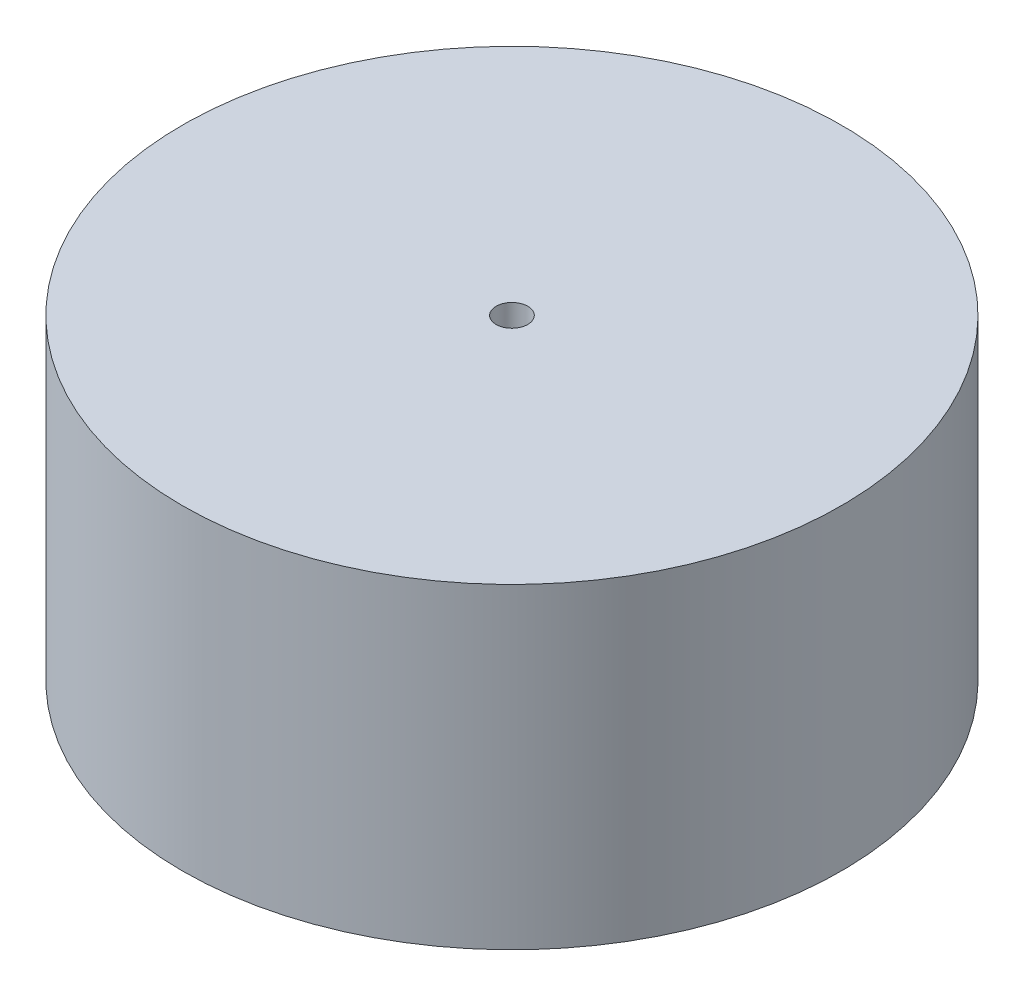
ISO-10303-21;
HEADER;
FILE_DESCRIPTION(('STEP AP214'),'2;1');
FILE_NAME('part.step','',(''),(''),'','','');
FILE_SCHEMA(('AUTOMOTIVE_DESIGN { 1 0 10303 214 1 1 1 1 }'));
ENDSEC;
DATA;
#1=APPLICATION_CONTEXT('core data for automotive mechanical design processes');
#2=APPLICATION_PROTOCOL_DEFINITION('international standard','automotive_design',2000,#1);
#3=PRODUCT_CONTEXT('',#1,'mechanical');
#4=PRODUCT('Part','Part','',(#3));
#5=PRODUCT_RELATED_PRODUCT_CATEGORY('part','',(#4));
#6=PRODUCT_DEFINITION_FORMATION('','',#4);
#7=PRODUCT_DEFINITION_CONTEXT('part definition',#1,'design');
#8=PRODUCT_DEFINITION('design','',#6,#7);
#9=PRODUCT_DEFINITION_SHAPE('','',#8);
#10=(LENGTH_UNIT() NAMED_UNIT(*) SI_UNIT(.MILLI.,.METRE.));
#11=(NAMED_UNIT(*) PLANE_ANGLE_UNIT() SI_UNIT($,.RADIAN.));
#12=(NAMED_UNIT(*) SI_UNIT($,.STERADIAN.) SOLID_ANGLE_UNIT());
#13=UNCERTAINTY_MEASURE_WITH_UNIT(LENGTH_MEASURE(1.E-05),#10,'distance_accuracy_value','');
#14=(GEOMETRIC_REPRESENTATION_CONTEXT(3) GLOBAL_UNCERTAINTY_ASSIGNED_CONTEXT((#13)) GLOBAL_UNIT_ASSIGNED_CONTEXT((#10,
#11,#12)) REPRESENTATION_CONTEXT('',''));
#15=CARTESIAN_POINT('',(0.,0.,0.));
#16=DIRECTION('',(0.,0.,1.));
#17=DIRECTION('',(1.,0.,0.));
#18=AXIS2_PLACEMENT_3D('',#15,#16,#17);
#19=CARTESIAN_POINT('',(0.,60.,0.));
#20=DIRECTION('',(0.,-1.,0.));
#21=DIRECTION('',(0.,0.,-1.));
#22=AXIS2_PLACEMENT_3D('',#19,#20,#21);
#23=CYLINDRICAL_SURFACE('',#22,62.5);
#24=CARTESIAN_POINT('',(0.,60.,0.));
#25=DIRECTION('',(0.,1.,0.));
#26=DIRECTION('',(0.,0.,1.));
#27=AXIS2_PLACEMENT_3D('',#24,#25,#26);
#28=CIRCLE('',#27,62.5);
#29=CARTESIAN_POINT('',(0.,60.,62.5));
#30=VERTEX_POINT('',#29);
#31=EDGE_CURVE('E10',#30,#30,#28,.T.);
#32=ORIENTED_EDGE('',*,*,#31,.F.);
#33=EDGE_LOOP('',(#32));
#34=FACE_BOUND('',#33,.T.);
#35=CARTESIAN_POINT('',(0.,0.,0.));
#36=DIRECTION('',(0.,1.,0.));
#37=DIRECTION('',(0.,0.,1.));
#38=AXIS2_PLACEMENT_3D('',#35,#36,#37);
#39=CIRCLE('',#38,62.5);
#40=CARTESIAN_POINT('',(0.,0.,62.5));
#41=VERTEX_POINT('',#40);
#42=EDGE_CURVE('E34',#41,#41,#39,.T.);
#43=ORIENTED_EDGE('',*,*,#42,.T.);
#44=EDGE_LOOP('',(#43));
#45=FACE_BOUND('',#44,.T.);
#46=ADVANCED_FACE('F31',(#34,#45),#23,.T.);
#47=CARTESIAN_POINT('',(0.,60.,0.));
#48=DIRECTION('',(0.,1.,0.));
#49=DIRECTION('',(0.,0.,1.));
#50=AXIS2_PLACEMENT_3D('',#47,#48,#49);
#51=PLANE('',#50);
#52=CARTESIAN_POINT('',(0.,60.,0.));
#53=DIRECTION('',(0.,-1.,0.));
#54=DIRECTION('',(0.,0.,-1.));
#55=AXIS2_PLACEMENT_3D('',#52,#53,#54);
#56=CIRCLE('',#55,3.);
#57=CARTESIAN_POINT('',(0.,60.,-3.));
#58=VERTEX_POINT('',#57);
#59=EDGE_CURVE('E41',#58,#58,#56,.T.);
#60=ORIENTED_EDGE('',*,*,#59,.T.);
#61=EDGE_LOOP('',(#60));
#62=FACE_BOUND('',#61,.T.);
#63=ORIENTED_EDGE('',*,*,#31,.T.);
#64=EDGE_LOOP('',(#63));
#65=FACE_BOUND('',#64,.T.);
#66=ADVANCED_FACE('F49',(#62,#65),#51,.T.);
#67=CARTESIAN_POINT('',(0.,0.,0.));
#68=DIRECTION('',(0.,1.,0.));
#69=DIRECTION('',(0.,0.,1.));
#70=AXIS2_PLACEMENT_3D('',#67,#68,#69);
#71=PLANE('',#70);
#72=CARTESIAN_POINT('',(0.,0.,0.));
#73=DIRECTION('',(0.,-1.,0.));
#74=DIRECTION('',(0.,0.,-1.));
#75=AXIS2_PLACEMENT_3D('',#72,#73,#74);
#76=CIRCLE('',#75,3.);
#77=CARTESIAN_POINT('',(0.,0.,-3.));
#78=VERTEX_POINT('',#77);
#79=EDGE_CURVE('E43',#78,#78,#76,.T.);
#80=ORIENTED_EDGE('',*,*,#79,.F.);
#81=EDGE_LOOP('',(#80));
#82=FACE_BOUND('',#81,.T.);
#83=ORIENTED_EDGE('',*,*,#42,.F.);
#84=EDGE_LOOP('',(#83));
#85=FACE_BOUND('',#84,.T.);
#86=ADVANCED_FACE('F54',(#82,#85),#71,.F.);
#87=CARTESIAN_POINT('',(0.,60.,0.));
#88=DIRECTION('',(0.,-1.,0.));
#89=DIRECTION('',(0.,0.,-1.));
#90=AXIS2_PLACEMENT_3D('',#87,#88,#89);
#91=CYLINDRICAL_SURFACE('',#90,3.);
#92=ORIENTED_EDGE('',*,*,#59,.F.);
#93=EDGE_LOOP('',(#92));
#94=FACE_BOUND('',#93,.T.);
#95=ORIENTED_EDGE('',*,*,#79,.T.);
#96=EDGE_LOOP('',(#95));
#97=FACE_BOUND('',#96,.T.);
#98=ADVANCED_FACE('F51',(#94,#97),#91,.F.);
#99=CLOSED_SHELL('',(#46,#66,#86,#98));
#100=MANIFOLD_SOLID_BREP('B2',#99);
#101=ADVANCED_BREP_SHAPE_REPRESENTATION('',(#18,#100),#14);
#102=SHAPE_DEFINITION_REPRESENTATION(#9,#101);
ENDSEC;
END-ISO-10303-21;
